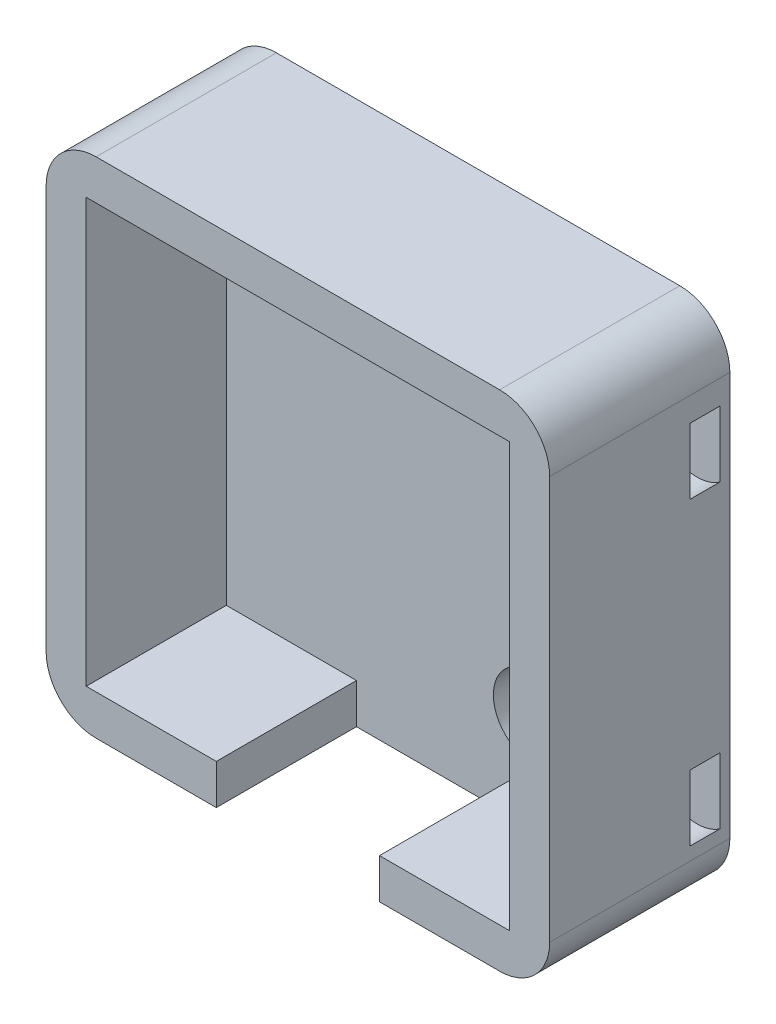
ISO-10303-21;
HEADER;
FILE_DESCRIPTION(('STEP AP214'),'2;1');
FILE_NAME('part.step','',(''),(''),'','','');
FILE_SCHEMA(('AUTOMOTIVE_DESIGN { 1 0 10303 214 1 1 1 1 }'));
ENDSEC;
DATA;
#1=APPLICATION_CONTEXT('core data for automotive mechanical design processes');
#2=APPLICATION_PROTOCOL_DEFINITION('international standard','automotive_design',2000,#1);
#3=PRODUCT_CONTEXT('',#1,'mechanical');
#4=PRODUCT('Part','Part','',(#3));
#5=PRODUCT_RELATED_PRODUCT_CATEGORY('part','',(#4));
#6=PRODUCT_DEFINITION_FORMATION('','',#4);
#7=PRODUCT_DEFINITION_CONTEXT('part definition',#1,'design');
#8=PRODUCT_DEFINITION('design','',#6,#7);
#9=PRODUCT_DEFINITION_SHAPE('','',#8);
#10=(LENGTH_UNIT() NAMED_UNIT(*) SI_UNIT(.MILLI.,.METRE.));
#11=(NAMED_UNIT(*) PLANE_ANGLE_UNIT() SI_UNIT($,.RADIAN.));
#12=(NAMED_UNIT(*) SI_UNIT($,.STERADIAN.) SOLID_ANGLE_UNIT());
#13=UNCERTAINTY_MEASURE_WITH_UNIT(LENGTH_MEASURE(1.E-05),#10,'distance_accuracy_value','');
#14=(GEOMETRIC_REPRESENTATION_CONTEXT(3) GLOBAL_UNCERTAINTY_ASSIGNED_CONTEXT((#13)) GLOBAL_UNIT_ASSIGNED_CONTEXT((#10,
#11,#12)) REPRESENTATION_CONTEXT('',''));
#15=CARTESIAN_POINT('',(0.,0.,0.));
#16=DIRECTION('',(0.,0.,1.));
#17=DIRECTION('',(1.,0.,0.));
#18=AXIS2_PLACEMENT_3D('',#15,#16,#17);
#19=CARTESIAN_POINT('',(50.3,0.,4.));
#20=DIRECTION('',(-1.,0.,0.));
#21=DIRECTION('',(0.,0.,1.));
#22=AXIS2_PLACEMENT_3D('',#19,#20,#21);
#23=PLANE('',#22);
#24=DIRECTION('',(0.,1.,0.));
#25=VECTOR('',#24,1.);
#26=CARTESIAN_POINT('',(50.3,0.,1.));
#27=LINE('',#26,#25);
#28=CARTESIAN_POINT('',(50.3,6.31049959872425,1.));
#29=VERTEX_POINT('',#28);
#30=CARTESIAN_POINT('',(50.3,12.8895004012762,1.));
#31=VERTEX_POINT('',#30);
#32=EDGE_CURVE('E295',#29,#31,#27,.T.);
#33=ORIENTED_EDGE('',*,*,#32,.F.);
#34=DIRECTION('',(0.,0.,1.));
#35=VECTOR('',#34,1.);
#36=CARTESIAN_POINT('',(50.3,6.31049959872425,1.));
#37=LINE('',#36,#35);
#38=CARTESIAN_POINT('',(50.3,6.31049959872425,4.));
#39=VERTEX_POINT('',#38);
#40=EDGE_CURVE('E292',#29,#39,#37,.T.);
#41=ORIENTED_EDGE('',*,*,#40,.T.);
#42=DIRECTION('',(0.,1.,0.));
#43=VECTOR('',#42,1.);
#44=CARTESIAN_POINT('',(50.3,0.,4.));
#45=LINE('',#44,#43);
#46=CARTESIAN_POINT('',(50.3,12.8895004012762,4.));
#47=VERTEX_POINT('',#46);
#48=EDGE_CURVE('E289',#39,#47,#45,.T.);
#49=ORIENTED_EDGE('',*,*,#48,.T.);
#50=DIRECTION('',(0.,0.,1.));
#51=VECTOR('',#50,1.);
#52=CARTESIAN_POINT('',(50.3,12.8895004012762,1.));
#53=LINE('',#52,#51);
#54=EDGE_CURVE('E202',#47,#31,#53,.F.);
#55=ORIENTED_EDGE('',*,*,#54,.T.);
#56=EDGE_LOOP('',(#33,#41,#49,#55));
#57=FACE_BOUND('',#56,.T.);
#58=DIRECTION('',(0.,1.,0.));
#59=VECTOR('',#58,1.);
#60=CARTESIAN_POINT('',(50.3,0.,0.));
#61=LINE('',#60,#59);
#62=CARTESIAN_POINT('',(50.3,5.,0.));
#63=VERTEX_POINT('',#62);
#64=CARTESIAN_POINT('',(50.3,45.3,0.));
#65=VERTEX_POINT('',#64);
#66=EDGE_CURVE('E267',#63,#65,#61,.T.);
#67=ORIENTED_EDGE('',*,*,#66,.T.);
#68=DIRECTION('',(0.,0.,-1.));
#69=VECTOR('',#68,1.);
#70=CARTESIAN_POINT('',(50.3,45.3,4.));
#71=LINE('',#70,#69);
#72=CARTESIAN_POINT('',(50.3,45.3,18.));
#73=VERTEX_POINT('',#72);
#74=EDGE_CURVE('E317',#65,#73,#71,.F.);
#75=ORIENTED_EDGE('',*,*,#74,.T.);
#76=DIRECTION('',(0.,1.,0.));
#77=VECTOR('',#76,1.);
#78=CARTESIAN_POINT('',(50.3,50.3,18.));
#79=LINE('',#78,#77);
#80=CARTESIAN_POINT('',(50.3,5.00000000000001,18.));
#81=VERTEX_POINT('',#80);
#82=EDGE_CURVE('E344',#81,#73,#79,.T.);
#83=ORIENTED_EDGE('',*,*,#82,.F.);
#84=DIRECTION('',(0.,0.,-1.));
#85=VECTOR('',#84,1.);
#86=CARTESIAN_POINT('',(50.3,5.,4.));
#87=LINE('',#86,#85);
#88=EDGE_CURVE('E314',#81,#63,#87,.T.);
#89=ORIENTED_EDGE('',*,*,#88,.T.);
#90=EDGE_LOOP('',(#67,#75,#83,#89));
#91=FACE_BOUND('',#90,.T.);
#92=DIRECTION('',(0.,1.,0.));
#93=VECTOR('',#92,1.);
#94=CARTESIAN_POINT('',(50.3,0.,1.));
#95=LINE('',#94,#93);
#96=CARTESIAN_POINT('',(50.3,36.3104995987245,1.));
#97=VERTEX_POINT('',#96);
#98=CARTESIAN_POINT('',(50.3,42.8895004012759,1.));
#99=VERTEX_POINT('',#98);
#100=EDGE_CURVE('E303',#97,#99,#95,.T.);
#101=ORIENTED_EDGE('',*,*,#100,.F.);
#102=DIRECTION('',(0.,0.,1.));
#103=VECTOR('',#102,1.);
#104=CARTESIAN_POINT('',(50.3,36.3104995987245,1.));
#105=LINE('',#104,#103);
#106=CARTESIAN_POINT('',(50.3,36.3104995987245,4.));
#107=VERTEX_POINT('',#106);
#108=EDGE_CURVE('E300',#97,#107,#105,.T.);
#109=ORIENTED_EDGE('',*,*,#108,.T.);
#110=DIRECTION('',(0.,1.,0.));
#111=VECTOR('',#110,1.);
#112=CARTESIAN_POINT('',(50.3,0.,4.));
#113=LINE('',#112,#111);
#114=CARTESIAN_POINT('',(50.3,42.8895004012759,4.));
#115=VERTEX_POINT('',#114);
#116=EDGE_CURVE('E665',#107,#115,#113,.T.);
#117=ORIENTED_EDGE('',*,*,#116,.T.);
#118=DIRECTION('',(0.,0.,1.));
#119=VECTOR('',#118,1.);
#120=CARTESIAN_POINT('',(50.3,42.8895004012759,1.));
#121=LINE('',#120,#119);
#122=EDGE_CURVE('E297',#115,#99,#121,.F.);
#123=ORIENTED_EDGE('',*,*,#122,.T.);
#124=EDGE_LOOP('',(#101,#109,#117,#123));
#125=FACE_BOUND('',#124,.T.);
#126=ADVANCED_FACE('F32',(#57,#91,#125),#23,.F.);
#127=CARTESIAN_POINT('',(34.6751338593466,9.59999999999672,18.));
#128=DIRECTION('',(0.,0.,-1.));
#129=DIRECTION('',(-1.,0.,0.));
#130=AXIS2_PLACEMENT_3D('',#127,#128,#129);
#131=CYLINDRICAL_SURFACE('',#130,1.5);
#132=CARTESIAN_POINT('',(34.6751338593466,9.59999999999672,0.));
#133=DIRECTION('',(0.,0.,-1.));
#134=DIRECTION('',(-1.,0.,0.));
#135=AXIS2_PLACEMENT_3D('',#132,#133,#134);
#136=CIRCLE('',#135,1.5);
#137=CARTESIAN_POINT('',(33.1751338593466,9.59999999999672,0.));
#138=VERTEX_POINT('',#137);
#139=EDGE_CURVE('E284',#138,#138,#136,.T.);
#140=ORIENTED_EDGE('',*,*,#139,.T.);
#141=EDGE_LOOP('',(#140));
#142=FACE_BOUND('',#141,.T.);
#143=CARTESIAN_POINT('',(34.6751338593466,9.59999999999672,1.));
#144=DIRECTION('',(0.,0.,1.));
#145=DIRECTION('',(1.,0.,0.));
#146=AXIS2_PLACEMENT_3D('',#143,#144,#145);
#147=CIRCLE('',#146,1.5);
#148=CARTESIAN_POINT('',(36.1751338593466,9.59999999999672,1.));
#149=VERTEX_POINT('',#148);
#150=EDGE_CURVE('E286',#149,#149,#147,.F.);
#151=ORIENTED_EDGE('',*,*,#150,.F.);
#152=EDGE_LOOP('',(#151));
#153=FACE_BOUND('',#152,.T.);
#154=ADVANCED_FACE('F415',(#142,#153),#131,.F.);
#155=CARTESIAN_POINT('',(34.6751338593463,39.5999999999967,18.));
#156=DIRECTION('',(0.,0.,-1.));
#157=DIRECTION('',(-1.,0.,0.));
#158=AXIS2_PLACEMENT_3D('',#155,#156,#157);
#159=CYLINDRICAL_SURFACE('',#158,1.5);
#160=CARTESIAN_POINT('',(34.6751338593463,39.5999999999967,0.));
#161=DIRECTION('',(0.,0.,-1.));
#162=DIRECTION('',(-1.,0.,0.));
#163=AXIS2_PLACEMENT_3D('',#160,#161,#162);
#164=CIRCLE('',#163,1.5);
#165=CARTESIAN_POINT('',(33.1751338593463,39.5999999999967,0.));
#166=VERTEX_POINT('',#165);
#167=EDGE_CURVE('E361',#166,#166,#164,.T.);
#168=ORIENTED_EDGE('',*,*,#167,.T.);
#169=EDGE_LOOP('',(#168));
#170=FACE_BOUND('',#169,.T.);
#171=CARTESIAN_POINT('',(34.6751338593463,39.5999999999967,1.));
#172=DIRECTION('',(0.,0.,1.));
#173=DIRECTION('',(1.,0.,0.));
#174=AXIS2_PLACEMENT_3D('',#171,#172,#173);
#175=CIRCLE('',#174,1.5);
#176=CARTESIAN_POINT('',(36.1751338593463,39.5999999999967,1.));
#177=VERTEX_POINT('',#176);
#178=EDGE_CURVE('E281',#177,#177,#175,.F.);
#179=ORIENTED_EDGE('',*,*,#178,.F.);
#180=EDGE_LOOP('',(#179));
#181=FACE_BOUND('',#180,.T.);
#182=ADVANCED_FACE('F423',(#170,#181),#159,.F.);
#183=CARTESIAN_POINT('',(0.,0.,4.));
#184=DIRECTION('',(0.,0.,-1.));
#185=DIRECTION('',(-1.,0.,0.));
#186=AXIS2_PLACEMENT_3D('',#183,#184,#185);
#187=PLANE('',#186);
#188=CARTESIAN_POINT('',(34.6751338593466,9.59999999999672,4.));
#189=DIRECTION('',(0.,0.,1.));
#190=DIRECTION('',(1.,0.,0.));
#191=AXIS2_PLACEMENT_3D('',#188,#189,#190);
#192=CIRCLE('',#191,4.00000000000001);
#193=CARTESIAN_POINT('',(38.6751338593466,9.59999999999672,4.));
#194=VERTEX_POINT('',#193);
#195=EDGE_CURVE('E675',#194,#194,#192,.T.);
#196=ORIENTED_EDGE('',*,*,#195,.F.);
#197=EDGE_LOOP('',(#196));
#198=FACE_BOUND('',#197,.T.);
#199=CARTESIAN_POINT('',(34.6751338593463,39.5999999999967,4.));
#200=DIRECTION('',(0.,0.,1.));
#201=DIRECTION('',(1.,0.,0.));
#202=AXIS2_PLACEMENT_3D('',#199,#200,#201);
#203=CIRCLE('',#202,4.);
#204=CARTESIAN_POINT('',(38.6751338593463,39.5999999999967,4.));
#205=VERTEX_POINT('',#204);
#206=EDGE_CURVE('E689',#205,#205,#203,.T.);
#207=ORIENTED_EDGE('',*,*,#206,.F.);
#208=EDGE_LOOP('',(#207));
#209=FACE_BOUND('',#208,.T.);
#210=DIRECTION('',(0.,-1.,0.));
#211=VECTOR('',#210,1.);
#212=CARTESIAN_POINT('',(46.3,46.3,4.));
#213=LINE('',#212,#211);
#214=CARTESIAN_POINT('',(46.3,35.9906960694212,4.));
#215=VERTEX_POINT('',#214);
#216=CARTESIAN_POINT('',(46.3,13.2093039305791,4.));
#217=VERTEX_POINT('',#216);
#218=EDGE_CURVE('E193',#215,#217,#213,.T.);
#219=ORIENTED_EDGE('',*,*,#218,.F.);
#220=CARTESIAN_POINT('',(48.0242172533375,39.6000000000002,4.));
#221=DIRECTION('',(0.,0.,1.));
#222=DIRECTION('',(1.,0.,0.));
#223=AXIS2_PLACEMENT_3D('',#220,#221,#222);
#224=CIRCLE('',#223,4.00000000000001);
#225=CARTESIAN_POINT('',(46.3,43.2093039305793,4.));
#226=VERTEX_POINT('',#225);
#227=EDGE_CURVE('E666',#226,#215,#224,.T.);
#228=ORIENTED_EDGE('',*,*,#227,.F.);
#229=CARTESIAN_POINT('',(46.3,46.3,4.));
#230=VERTEX_POINT('',#229);
#231=EDGE_CURVE('E215',#230,#226,#213,.T.);
#232=ORIENTED_EDGE('',*,*,#231,.F.);
#233=DIRECTION('',(1.,0.,0.));
#234=VECTOR('',#233,1.);
#235=CARTESIAN_POINT('',(4.,46.3,4.));
#236=LINE('',#235,#234);
#237=CARTESIAN_POINT('',(4.,46.3,4.));
#238=VERTEX_POINT('',#237);
#239=EDGE_CURVE('E219',#238,#230,#236,.T.);
#240=ORIENTED_EDGE('',*,*,#239,.F.);
#241=DIRECTION('',(0.,1.,0.));
#242=VECTOR('',#241,1.);
#243=CARTESIAN_POINT('',(4.,46.3,4.));
#244=LINE('',#243,#242);
#245=CARTESIAN_POINT('',(4.00000000000001,4.,4.));
#246=VERTEX_POINT('',#245);
#247=EDGE_CURVE('E359',#246,#238,#244,.T.);
#248=ORIENTED_EDGE('',*,*,#247,.F.);
#249=DIRECTION('',(-1.,0.,0.));
#250=VECTOR('',#249,1.);
#251=CARTESIAN_POINT('',(4.00000000000001,4.,4.));
#252=LINE('',#251,#250);
#253=CARTESIAN_POINT('',(17.,4.,4.));
#254=VERTEX_POINT('',#253);
#255=EDGE_CURVE('E229',#254,#246,#252,.T.);
#256=ORIENTED_EDGE('',*,*,#255,.F.);
#257=DIRECTION('',(0.,1.,0.));
#258=VECTOR('',#257,1.);
#259=CARTESIAN_POINT('',(17.,4.,4.));
#260=LINE('',#259,#258);
#261=CARTESIAN_POINT('',(17.,0.,4.));
#262=VERTEX_POINT('',#261);
#263=EDGE_CURVE('E226',#262,#254,#260,.T.);
#264=ORIENTED_EDGE('',*,*,#263,.F.);
#265=DIRECTION('',(1.,0.,0.));
#266=VECTOR('',#265,1.);
#267=CARTESIAN_POINT('',(0.,0.,4.));
#268=LINE('',#267,#266);
#269=CARTESIAN_POINT('',(33.3,0.,4.));
#270=VERTEX_POINT('',#269);
#271=EDGE_CURVE('E259',#262,#270,#268,.T.);
#272=ORIENTED_EDGE('',*,*,#271,.T.);
#273=DIRECTION('',(0.,-1.,0.));
#274=VECTOR('',#273,1.);
#275=CARTESIAN_POINT('',(33.3,4.00000000000001,4.));
#276=LINE('',#275,#274);
#277=CARTESIAN_POINT('',(33.3,4.00000000000001,4.));
#278=VERTEX_POINT('',#277);
#279=EDGE_CURVE('E223',#278,#270,#276,.T.);
#280=ORIENTED_EDGE('',*,*,#279,.F.);
#281=DIRECTION('',(-1.,0.,0.));
#282=VECTOR('',#281,1.);
#283=CARTESIAN_POINT('',(33.3,4.00000000000001,4.));
#284=LINE('',#283,#282);
#285=CARTESIAN_POINT('',(46.3,4.,4.));
#286=VERTEX_POINT('',#285);
#287=EDGE_CURVE('E218',#286,#278,#284,.T.);
#288=ORIENTED_EDGE('',*,*,#287,.F.);
#289=CARTESIAN_POINT('',(46.3,5.99069606942131,4.));
#290=VERTEX_POINT('',#289);
#291=EDGE_CURVE('E194',#290,#286,#213,.T.);
#292=ORIENTED_EDGE('',*,*,#291,.F.);
#293=CARTESIAN_POINT('',(48.0242172533378,9.60000000000021,4.));
#294=DIRECTION('',(0.,0.,1.));
#295=DIRECTION('',(1.,0.,0.));
#296=AXIS2_PLACEMENT_3D('',#293,#294,#295);
#297=CIRCLE('',#296,4.00000000000001);
#298=EDGE_CURVE('E200',#217,#290,#297,.T.);
#299=ORIENTED_EDGE('',*,*,#298,.F.);
#300=EDGE_LOOP('',(#219,#228,#232,#240,#248,#256,#264,#272,#280,#288,#292,#299));
#301=FACE_BOUND('',#300,.T.);
#302=ADVANCED_FACE('F208',(#198,#209,#301),#187,.F.);
#303=CARTESIAN_POINT('',(0.,0.,4.));
#304=DIRECTION('',(1.,0.,0.));
#305=DIRECTION('',(0.,0.,-1.));
#306=AXIS2_PLACEMENT_3D('',#303,#304,#305);
#307=PLANE('',#306);
#308=DIRECTION('',(0.,-1.,0.));
#309=VECTOR('',#308,1.);
#310=CARTESIAN_POINT('',(0.,0.,0.));
#311=LINE('',#310,#309);
#312=CARTESIAN_POINT('',(0.,45.3,0.));
#313=VERTEX_POINT('',#312);
#314=CARTESIAN_POINT('',(0.,5.,0.));
#315=VERTEX_POINT('',#314);
#316=EDGE_CURVE('E258',#313,#315,#311,.T.);
#317=ORIENTED_EDGE('',*,*,#316,.T.);
#318=DIRECTION('',(0.,0.,-1.));
#319=VECTOR('',#318,1.);
#320=CARTESIAN_POINT('',(0.,5.,4.));
#321=LINE('',#320,#319);
#322=CARTESIAN_POINT('',(0.,5.00000000000001,18.));
#323=VERTEX_POINT('',#322);
#324=EDGE_CURVE('E11',#315,#323,#321,.F.);
#325=ORIENTED_EDGE('',*,*,#324,.T.);
#326=DIRECTION('',(0.,-1.,0.));
#327=VECTOR('',#326,1.);
#328=CARTESIAN_POINT('',(0.,50.3,18.));
#329=LINE('',#328,#327);
#330=CARTESIAN_POINT('',(0.,45.3,18.));
#331=VERTEX_POINT('',#330);
#332=EDGE_CURVE('E349',#331,#323,#329,.T.);
#333=ORIENTED_EDGE('',*,*,#332,.F.);
#334=DIRECTION('',(0.,0.,-1.));
#335=VECTOR('',#334,1.);
#336=CARTESIAN_POINT('',(0.,45.3,4.));
#337=LINE('',#336,#335);
#338=EDGE_CURVE('E261',#331,#313,#337,.T.);
#339=ORIENTED_EDGE('',*,*,#338,.T.);
#340=EDGE_LOOP('',(#317,#325,#333,#339));
#341=FACE_BOUND('',#340,.T.);
#342=ADVANCED_FACE('F433',(#341),#307,.F.);
#343=CARTESIAN_POINT('',(0.,0.,4.));
#344=DIRECTION('',(0.,1.,0.));
#345=DIRECTION('',(0.,0.,1.));
#346=AXIS2_PLACEMENT_3D('',#343,#344,#345);
#347=PLANE('',#346);
#348=DIRECTION('',(1.,0.,0.));
#349=VECTOR('',#348,1.);
#350=CARTESIAN_POINT('',(0.,0.,18.));
#351=LINE('',#350,#349);
#352=CARTESIAN_POINT('',(5.,0.,18.));
#353=VERTEX_POINT('',#352);
#354=CARTESIAN_POINT('',(17.,0.,18.));
#355=VERTEX_POINT('',#354);
#356=EDGE_CURVE('E329',#353,#355,#351,.T.);
#357=ORIENTED_EDGE('',*,*,#356,.F.);
#358=DIRECTION('',(0.,0.,-1.));
#359=VECTOR('',#358,1.);
#360=CARTESIAN_POINT('',(5.,0.,4.));
#361=LINE('',#360,#359);
#362=CARTESIAN_POINT('',(5.,0.,0.));
#363=VERTEX_POINT('',#362);
#364=EDGE_CURVE('E40',#353,#363,#361,.T.);
#365=ORIENTED_EDGE('',*,*,#364,.T.);
#366=DIRECTION('',(1.,0.,0.));
#367=VECTOR('',#366,1.);
#368=CARTESIAN_POINT('',(0.,0.,0.));
#369=LINE('',#368,#367);
#370=CARTESIAN_POINT('',(45.3,0.,0.));
#371=VERTEX_POINT('',#370);
#372=EDGE_CURVE('E265',#363,#371,#369,.T.);
#373=ORIENTED_EDGE('',*,*,#372,.T.);
#374=DIRECTION('',(0.,0.,-1.));
#375=VECTOR('',#374,1.);
#376=CARTESIAN_POINT('',(45.3,0.,4.));
#377=LINE('',#376,#375);
#378=CARTESIAN_POINT('',(45.3,0.,18.));
#379=VERTEX_POINT('',#378);
#380=EDGE_CURVE('E47',#371,#379,#377,.F.);
#381=ORIENTED_EDGE('',*,*,#380,.T.);
#382=DIRECTION('',(1.,0.,0.));
#383=VECTOR('',#382,1.);
#384=CARTESIAN_POINT('',(33.3,0.,18.));
#385=LINE('',#384,#383);
#386=CARTESIAN_POINT('',(33.3,0.,18.));
#387=VERTEX_POINT('',#386);
#388=EDGE_CURVE('E347',#387,#379,#385,.T.);
#389=ORIENTED_EDGE('',*,*,#388,.F.);
#390=DIRECTION('',(0.,0.,-1.));
#391=VECTOR('',#390,1.);
#392=CARTESIAN_POINT('',(33.3,0.,18.));
#393=LINE('',#392,#391);
#394=EDGE_CURVE('E243',#387,#270,#393,.T.);
#395=ORIENTED_EDGE('',*,*,#394,.T.);
#396=ORIENTED_EDGE('',*,*,#271,.F.);
#397=DIRECTION('',(0.,0.,-1.));
#398=VECTOR('',#397,1.);
#399=CARTESIAN_POINT('',(17.,0.,18.));
#400=LINE('',#399,#398);
#401=EDGE_CURVE('E240',#355,#262,#400,.T.);
#402=ORIENTED_EDGE('',*,*,#401,.F.);
#403=EDGE_LOOP('',(#357,#365,#373,#381,#389,#395,#396,#402));
#404=FACE_BOUND('',#403,.T.);
#405=ADVANCED_FACE('F327',(#404),#347,.F.);
#406=CARTESIAN_POINT('',(0.,50.3,4.));
#407=DIRECTION('',(0.,-1.,0.));
#408=DIRECTION('',(0.,0.,-1.));
#409=AXIS2_PLACEMENT_3D('',#406,#407,#408);
#410=PLANE('',#409);
#411=DIRECTION('',(-1.,0.,0.));
#412=VECTOR('',#411,1.);
#413=CARTESIAN_POINT('',(0.,50.3,18.));
#414=LINE('',#413,#412);
#415=CARTESIAN_POINT('',(45.3,50.3,18.));
#416=VERTEX_POINT('',#415);
#417=CARTESIAN_POINT('',(5.,50.3,18.));
#418=VERTEX_POINT('',#417);
#419=EDGE_CURVE('E346',#416,#418,#414,.T.);
#420=ORIENTED_EDGE('',*,*,#419,.F.);
#421=DIRECTION('',(0.,0.,-1.));
#422=VECTOR('',#421,1.);
#423=CARTESIAN_POINT('',(45.3,50.3,4.));
#424=LINE('',#423,#422);
#425=CARTESIAN_POINT('',(45.3,50.3,0.));
#426=VERTEX_POINT('',#425);
#427=EDGE_CURVE('E305',#416,#426,#424,.T.);
#428=ORIENTED_EDGE('',*,*,#427,.T.);
#429=DIRECTION('',(-1.,0.,0.));
#430=VECTOR('',#429,1.);
#431=CARTESIAN_POINT('',(0.,50.3,0.));
#432=LINE('',#431,#430);
#433=CARTESIAN_POINT('',(5.,50.3,0.));
#434=VERTEX_POINT('',#433);
#435=EDGE_CURVE('E262',#426,#434,#432,.T.);
#436=ORIENTED_EDGE('',*,*,#435,.T.);
#437=DIRECTION('',(0.,0.,-1.));
#438=VECTOR('',#437,1.);
#439=CARTESIAN_POINT('',(5.,50.3,4.));
#440=LINE('',#439,#438);
#441=EDGE_CURVE('E276',#434,#418,#440,.F.);
#442=ORIENTED_EDGE('',*,*,#441,.T.);
#443=EDGE_LOOP('',(#420,#428,#436,#442));
#444=FACE_BOUND('',#443,.T.);
#445=ADVANCED_FACE('F429',(#444),#410,.F.);
#446=CARTESIAN_POINT('',(0.,0.,0.));
#447=DIRECTION('',(0.,0.,-1.));
#448=DIRECTION('',(-1.,0.,0.));
#449=AXIS2_PLACEMENT_3D('',#446,#447,#448);
#450=PLANE('',#449);
#451=ORIENTED_EDGE('',*,*,#139,.F.);
#452=EDGE_LOOP('',(#451));
#453=FACE_BOUND('',#452,.T.);
#454=ORIENTED_EDGE('',*,*,#167,.F.);
#455=EDGE_LOOP('',(#454));
#456=FACE_BOUND('',#455,.T.);
#457=ORIENTED_EDGE('',*,*,#435,.F.);
#458=CARTESIAN_POINT('',(45.3,45.3,0.));
#459=DIRECTION('',(0.,0.,-1.));
#460=DIRECTION('',(-1.,0.,0.));
#461=AXIS2_PLACEMENT_3D('',#458,#459,#460);
#462=CIRCLE('',#461,5.);
#463=EDGE_CURVE('E312',#426,#65,#462,.T.);
#464=ORIENTED_EDGE('',*,*,#463,.T.);
#465=ORIENTED_EDGE('',*,*,#66,.F.);
#466=CARTESIAN_POINT('',(45.3,5.,0.));
#467=DIRECTION('',(0.,0.,-1.));
#468=DIRECTION('',(-1.,0.,0.));
#469=AXIS2_PLACEMENT_3D('',#466,#467,#468);
#470=CIRCLE('',#469,5.);
#471=EDGE_CURVE('E308',#63,#371,#470,.T.);
#472=ORIENTED_EDGE('',*,*,#471,.T.);
#473=ORIENTED_EDGE('',*,*,#372,.F.);
#474=CARTESIAN_POINT('',(5.,5.,0.));
#475=DIRECTION('',(0.,0.,-1.));
#476=DIRECTION('',(-1.,0.,0.));
#477=AXIS2_PLACEMENT_3D('',#474,#475,#476);
#478=CIRCLE('',#477,5.);
#479=EDGE_CURVE('E310',#363,#315,#478,.T.);
#480=ORIENTED_EDGE('',*,*,#479,.T.);
#481=ORIENTED_EDGE('',*,*,#316,.F.);
#482=CARTESIAN_POINT('',(5.,45.3,0.));
#483=DIRECTION('',(0.,0.,-1.));
#484=DIRECTION('',(-1.,0.,0.));
#485=AXIS2_PLACEMENT_3D('',#482,#483,#484);
#486=CIRCLE('',#485,5.);
#487=EDGE_CURVE('E273',#313,#434,#486,.T.);
#488=ORIENTED_EDGE('',*,*,#487,.T.);
#489=EDGE_LOOP('',(#457,#464,#465,#472,#473,#480,#481,#488));
#490=FACE_BOUND('',#489,.T.);
#491=ADVANCED_FACE('F333',(#453,#456,#490),#450,.T.);
#492=CARTESIAN_POINT('',(4.,46.3,18.));
#493=DIRECTION('',(-1.,0.,0.));
#494=DIRECTION('',(0.,-1.,0.));
#495=AXIS2_PLACEMENT_3D('',#492,#493,#494);
#496=PLANE('',#495);
#497=ORIENTED_EDGE('',*,*,#247,.T.);
#498=DIRECTION('',(0.,0.,-1.));
#499=VECTOR('',#498,1.);
#500=CARTESIAN_POINT('',(4.,46.3,18.));
#501=LINE('',#500,#499);
#502=CARTESIAN_POINT('',(4.,46.3,18.));
#503=VERTEX_POINT('',#502);
#504=EDGE_CURVE('E255',#503,#238,#501,.T.);
#505=ORIENTED_EDGE('',*,*,#504,.F.);
#506=DIRECTION('',(0.,1.,0.));
#507=VECTOR('',#506,1.);
#508=CARTESIAN_POINT('',(4.,46.3,18.));
#509=LINE('',#508,#507);
#510=CARTESIAN_POINT('',(4.00000000000001,4.,18.));
#511=VERTEX_POINT('',#510);
#512=EDGE_CURVE('E232',#511,#503,#509,.T.);
#513=ORIENTED_EDGE('',*,*,#512,.F.);
#514=DIRECTION('',(0.,0.,-1.));
#515=VECTOR('',#514,1.);
#516=CARTESIAN_POINT('',(4.00000000000001,4.,18.));
#517=LINE('',#516,#515);
#518=EDGE_CURVE('E233',#511,#246,#517,.T.);
#519=ORIENTED_EDGE('',*,*,#518,.T.);
#520=EDGE_LOOP('',(#497,#505,#513,#519));
#521=FACE_BOUND('',#520,.T.);
#522=ADVANCED_FACE('F397',(#521),#496,.F.);
#523=CARTESIAN_POINT('',(4.,46.3,18.));
#524=DIRECTION('',(0.,1.,0.));
#525=DIRECTION('',(0.,0.,1.));
#526=AXIS2_PLACEMENT_3D('',#523,#524,#525);
#527=PLANE('',#526);
#528=ORIENTED_EDGE('',*,*,#239,.T.);
#529=DIRECTION('',(0.,0.,-1.));
#530=VECTOR('',#529,1.);
#531=CARTESIAN_POINT('',(46.3,46.3,18.));
#532=LINE('',#531,#530);
#533=CARTESIAN_POINT('',(46.3,46.3,18.));
#534=VERTEX_POINT('',#533);
#535=EDGE_CURVE('E252',#534,#230,#532,.T.);
#536=ORIENTED_EDGE('',*,*,#535,.F.);
#537=DIRECTION('',(1.,0.,0.));
#538=VECTOR('',#537,1.);
#539=CARTESIAN_POINT('',(4.,46.3,18.));
#540=LINE('',#539,#538);
#541=EDGE_CURVE('E375',#503,#534,#540,.T.);
#542=ORIENTED_EDGE('',*,*,#541,.F.);
#543=ORIENTED_EDGE('',*,*,#504,.T.);
#544=EDGE_LOOP('',(#528,#536,#542,#543));
#545=FACE_BOUND('',#544,.T.);
#546=ADVANCED_FACE('F399',(#545),#527,.F.);
#547=CARTESIAN_POINT('',(46.3,46.3,18.));
#548=DIRECTION('',(1.,0.,0.));
#549=DIRECTION('',(0.,1.,0.));
#550=AXIS2_PLACEMENT_3D('',#547,#548,#549);
#551=PLANE('',#550);
#552=ORIENTED_EDGE('',*,*,#231,.T.);
#553=EDGE_CURVE('E214',#226,#215,#213,.T.);
#554=ORIENTED_EDGE('',*,*,#553,.T.);
#555=ORIENTED_EDGE('',*,*,#218,.T.);
#556=EDGE_CURVE('E183',#217,#290,#213,.T.);
#557=ORIENTED_EDGE('',*,*,#556,.T.);
#558=ORIENTED_EDGE('',*,*,#291,.T.);
#559=DIRECTION('',(0.,0.,-1.));
#560=VECTOR('',#559,1.);
#561=CARTESIAN_POINT('',(46.3,4.,18.));
#562=LINE('',#561,#560);
#563=CARTESIAN_POINT('',(46.3,4.,18.));
#564=VERTEX_POINT('',#563);
#565=EDGE_CURVE('E249',#564,#286,#562,.T.);
#566=ORIENTED_EDGE('',*,*,#565,.F.);
#567=DIRECTION('',(0.,-1.,0.));
#568=VECTOR('',#567,1.);
#569=CARTESIAN_POINT('',(46.3,46.3,18.));
#570=LINE('',#569,#568);
#571=EDGE_CURVE('E377',#534,#564,#570,.T.);
#572=ORIENTED_EDGE('',*,*,#571,.F.);
#573=ORIENTED_EDGE('',*,*,#535,.T.);
#574=EDGE_LOOP('',(#552,#554,#555,#557,#558,#566,#572,#573));
#575=FACE_BOUND('',#574,.T.);
#576=ADVANCED_FACE('F213',(#575),#551,.F.);
#577=CARTESIAN_POINT('',(33.3,4.00000000000001,18.));
#578=DIRECTION('',(0.,-1.,0.));
#579=DIRECTION('',(1.,0.,0.));
#580=AXIS2_PLACEMENT_3D('',#577,#578,#579);
#581=PLANE('',#580);
#582=ORIENTED_EDGE('',*,*,#287,.T.);
#583=DIRECTION('',(0.,0.,-1.));
#584=VECTOR('',#583,1.);
#585=CARTESIAN_POINT('',(33.3,4.00000000000001,18.));
#586=LINE('',#585,#584);
#587=CARTESIAN_POINT('',(33.3,4.00000000000001,18.));
#588=VERTEX_POINT('',#587);
#589=EDGE_CURVE('E246',#588,#278,#586,.T.);
#590=ORIENTED_EDGE('',*,*,#589,.F.);
#591=DIRECTION('',(-1.,0.,0.));
#592=VECTOR('',#591,1.);
#593=CARTESIAN_POINT('',(33.3,4.00000000000001,18.));
#594=LINE('',#593,#592);
#595=EDGE_CURVE('E379',#564,#588,#594,.T.);
#596=ORIENTED_EDGE('',*,*,#595,.F.);
#597=ORIENTED_EDGE('',*,*,#565,.T.);
#598=EDGE_LOOP('',(#582,#590,#596,#597));
#599=FACE_BOUND('',#598,.T.);
#600=ADVANCED_FACE('F404',(#599),#581,.F.);
#601=CARTESIAN_POINT('',(33.3,4.00000000000001,18.));
#602=DIRECTION('',(1.,0.,0.));
#603=DIRECTION('',(0.,0.,-1.));
#604=AXIS2_PLACEMENT_3D('',#601,#602,#603);
#605=PLANE('',#604);
#606=ORIENTED_EDGE('',*,*,#279,.T.);
#607=ORIENTED_EDGE('',*,*,#394,.F.);
#608=DIRECTION('',(0.,-1.,0.));
#609=VECTOR('',#608,1.);
#610=CARTESIAN_POINT('',(33.3,4.00000000000001,18.));
#611=LINE('',#610,#609);
#612=EDGE_CURVE('E351',#588,#387,#611,.T.);
#613=ORIENTED_EDGE('',*,*,#612,.F.);
#614=ORIENTED_EDGE('',*,*,#589,.T.);
#615=EDGE_LOOP('',(#606,#607,#613,#614));
#616=FACE_BOUND('',#615,.T.);
#617=ADVANCED_FACE('F386',(#616),#605,.F.);
#618=CARTESIAN_POINT('',(17.,4.,18.));
#619=DIRECTION('',(-1.,0.,0.));
#620=DIRECTION('',(0.,0.,1.));
#621=AXIS2_PLACEMENT_3D('',#618,#619,#620);
#622=PLANE('',#621);
#623=ORIENTED_EDGE('',*,*,#263,.T.);
#624=DIRECTION('',(0.,0.,-1.));
#625=VECTOR('',#624,1.);
#626=CARTESIAN_POINT('',(17.,4.,18.));
#627=LINE('',#626,#625);
#628=CARTESIAN_POINT('',(17.,4.,18.));
#629=VERTEX_POINT('',#628);
#630=EDGE_CURVE('E236',#629,#254,#627,.T.);
#631=ORIENTED_EDGE('',*,*,#630,.F.);
#632=DIRECTION('',(0.,1.,0.));
#633=VECTOR('',#632,1.);
#634=CARTESIAN_POINT('',(17.,4.,18.));
#635=LINE('',#634,#633);
#636=EDGE_CURVE('E357',#355,#629,#635,.T.);
#637=ORIENTED_EDGE('',*,*,#636,.F.);
#638=ORIENTED_EDGE('',*,*,#401,.T.);
#639=EDGE_LOOP('',(#623,#631,#637,#638));
#640=FACE_BOUND('',#639,.T.);
#641=ADVANCED_FACE('F390',(#640),#622,.F.);
#642=CARTESIAN_POINT('',(4.00000000000001,4.,18.));
#643=DIRECTION('',(0.,-1.,0.));
#644=DIRECTION('',(1.,0.,0.));
#645=AXIS2_PLACEMENT_3D('',#642,#643,#644);
#646=PLANE('',#645);
#647=ORIENTED_EDGE('',*,*,#255,.T.);
#648=ORIENTED_EDGE('',*,*,#518,.F.);
#649=DIRECTION('',(-1.,0.,0.));
#650=VECTOR('',#649,1.);
#651=CARTESIAN_POINT('',(4.00000000000001,4.,18.));
#652=LINE('',#651,#650);
#653=EDGE_CURVE('E237',#629,#511,#652,.T.);
#654=ORIENTED_EDGE('',*,*,#653,.F.);
#655=ORIENTED_EDGE('',*,*,#630,.T.);
#656=EDGE_LOOP('',(#647,#648,#654,#655));
#657=FACE_BOUND('',#656,.T.);
#658=ADVANCED_FACE('F396',(#657),#646,.F.);
#659=CARTESIAN_POINT('',(0.,0.,18.));
#660=DIRECTION('',(0.,0.,1.));
#661=DIRECTION('',(1.,0.,0.));
#662=AXIS2_PLACEMENT_3D('',#659,#660,#661);
#663=PLANE('',#662);
#664=ORIENTED_EDGE('',*,*,#82,.T.);
#665=CARTESIAN_POINT('',(45.3,45.3,18.));
#666=DIRECTION('',(0.,0.,1.));
#667=DIRECTION('',(1.,0.,0.));
#668=AXIS2_PLACEMENT_3D('',#665,#666,#667);
#669=CIRCLE('',#668,5.);
#670=EDGE_CURVE('E322',#73,#416,#669,.T.);
#671=ORIENTED_EDGE('',*,*,#670,.T.);
#672=ORIENTED_EDGE('',*,*,#419,.T.);
#673=CARTESIAN_POINT('',(5.,45.3,18.));
#674=DIRECTION('',(0.,0.,1.));
#675=DIRECTION('',(1.,0.,0.));
#676=AXIS2_PLACEMENT_3D('',#673,#674,#675);
#677=CIRCLE('',#676,5.);
#678=EDGE_CURVE('E279',#418,#331,#677,.T.);
#679=ORIENTED_EDGE('',*,*,#678,.T.);
#680=ORIENTED_EDGE('',*,*,#332,.T.);
#681=CARTESIAN_POINT('',(5.,5.,18.));
#682=DIRECTION('',(0.,0.,1.));
#683=DIRECTION('',(1.,0.,0.));
#684=AXIS2_PLACEMENT_3D('',#681,#682,#683);
#685=CIRCLE('',#684,5.);
#686=EDGE_CURVE('E55',#323,#353,#685,.T.);
#687=ORIENTED_EDGE('',*,*,#686,.T.);
#688=ORIENTED_EDGE('',*,*,#356,.T.);
#689=ORIENTED_EDGE('',*,*,#636,.T.);
#690=ORIENTED_EDGE('',*,*,#653,.T.);
#691=ORIENTED_EDGE('',*,*,#512,.T.);
#692=ORIENTED_EDGE('',*,*,#541,.T.);
#693=ORIENTED_EDGE('',*,*,#571,.T.);
#694=ORIENTED_EDGE('',*,*,#595,.T.);
#695=ORIENTED_EDGE('',*,*,#612,.T.);
#696=ORIENTED_EDGE('',*,*,#388,.T.);
#697=CARTESIAN_POINT('',(45.3,5.,18.));
#698=DIRECTION('',(0.,0.,1.));
#699=DIRECTION('',(1.,0.,0.));
#700=AXIS2_PLACEMENT_3D('',#697,#698,#699);
#701=CIRCLE('',#700,5.);
#702=EDGE_CURVE('E319',#379,#81,#701,.T.);
#703=ORIENTED_EDGE('',*,*,#702,.T.);
#704=EDGE_LOOP('',(#664,#671,#672,#679,#680,#687,#688,#689,#690,#691,#692,#693,#694,#695,#696,#703));
#705=FACE_BOUND('',#704,.T.);
#706=ADVANCED_FACE('F382',(#705),#663,.T.);
#707=CARTESIAN_POINT('',(5.,45.3,4.));
#708=DIRECTION('',(0.,0.,-1.));
#709=DIRECTION('',(-1.,0.,0.));
#710=AXIS2_PLACEMENT_3D('',#707,#708,#709);
#711=CYLINDRICAL_SURFACE('',#710,5.);
#712=ORIENTED_EDGE('',*,*,#678,.F.);
#713=ORIENTED_EDGE('',*,*,#441,.F.);
#714=ORIENTED_EDGE('',*,*,#487,.F.);
#715=ORIENTED_EDGE('',*,*,#338,.F.);
#716=EDGE_LOOP('',(#712,#713,#714,#715));
#717=FACE_BOUND('',#716,.T.);
#718=ADVANCED_FACE('F436',(#717),#711,.T.);
#719=CARTESIAN_POINT('',(34.6751338593463,39.5999999999967,1.));
#720=DIRECTION('',(0.,0.,1.));
#721=DIRECTION('',(1.,0.,0.));
#722=AXIS2_PLACEMENT_3D('',#719,#720,#721);
#723=PLANE('',#722);
#724=CARTESIAN_POINT('',(34.6751338593463,39.5999999999967,1.));
#725=DIRECTION('',(0.,0.,1.));
#726=DIRECTION('',(1.,0.,0.));
#727=AXIS2_PLACEMENT_3D('',#724,#725,#726);
#728=CIRCLE('',#727,4.);
#729=CARTESIAN_POINT('',(38.6751338593463,39.5999999999967,1.));
#730=VERTEX_POINT('',#729);
#731=EDGE_CURVE('E285',#730,#730,#728,.T.);
#732=ORIENTED_EDGE('',*,*,#731,.T.);
#733=EDGE_LOOP('',(#732));
#734=FACE_BOUND('',#733,.T.);
#735=ORIENTED_EDGE('',*,*,#178,.T.);
#736=EDGE_LOOP('',(#735));
#737=FACE_BOUND('',#736,.T.);
#738=ADVANCED_FACE('F439',(#734,#737),#723,.T.);
#739=CARTESIAN_POINT('',(34.6751338593463,39.5999999999967,1.));
#740=DIRECTION('',(0.,0.,1.));
#741=DIRECTION('',(1.,0.,0.));
#742=AXIS2_PLACEMENT_3D('',#739,#740,#741);
#743=CYLINDRICAL_SURFACE('',#742,4.);
#744=ORIENTED_EDGE('',*,*,#731,.F.);
#745=EDGE_LOOP('',(#744));
#746=FACE_BOUND('',#745,.T.);
#747=ORIENTED_EDGE('',*,*,#206,.T.);
#748=EDGE_LOOP('',(#747));
#749=FACE_BOUND('',#748,.T.);
#750=ADVANCED_FACE('F495',(#746,#749),#743,.F.);
#751=CARTESIAN_POINT('',(34.6751338593466,9.59999999999672,1.));
#752=DIRECTION('',(0.,0.,1.));
#753=DIRECTION('',(1.,0.,0.));
#754=AXIS2_PLACEMENT_3D('',#751,#752,#753);
#755=PLANE('',#754);
#756=CARTESIAN_POINT('',(34.6751338593466,9.59999999999672,1.));
#757=DIRECTION('',(0.,0.,1.));
#758=DIRECTION('',(1.,0.,0.));
#759=AXIS2_PLACEMENT_3D('',#756,#757,#758);
#760=CIRCLE('',#759,4.00000000000001);
#761=CARTESIAN_POINT('',(38.6751338593466,9.59999999999672,1.));
#762=VERTEX_POINT('',#761);
#763=EDGE_CURVE('E290',#762,#762,#760,.T.);
#764=ORIENTED_EDGE('',*,*,#763,.T.);
#765=EDGE_LOOP('',(#764));
#766=FACE_BOUND('',#765,.T.);
#767=ORIENTED_EDGE('',*,*,#150,.T.);
#768=EDGE_LOOP('',(#767));
#769=FACE_BOUND('',#768,.T.);
#770=ADVANCED_FACE('F506',(#766,#769),#755,.T.);
#771=CARTESIAN_POINT('',(34.6751338593466,9.59999999999672,1.));
#772=DIRECTION('',(0.,0.,1.));
#773=DIRECTION('',(1.,0.,0.));
#774=AXIS2_PLACEMENT_3D('',#771,#772,#773);
#775=CYLINDRICAL_SURFACE('',#774,4.00000000000001);
#776=ORIENTED_EDGE('',*,*,#763,.F.);
#777=EDGE_LOOP('',(#776));
#778=FACE_BOUND('',#777,.T.);
#779=ORIENTED_EDGE('',*,*,#195,.T.);
#780=EDGE_LOOP('',(#779));
#781=FACE_BOUND('',#780,.T.);
#782=ADVANCED_FACE('F516',(#778,#781),#775,.F.);
#783=CARTESIAN_POINT('',(48.0242172533378,9.60000000000021,1.));
#784=DIRECTION('',(0.,0.,1.));
#785=DIRECTION('',(1.,0.,0.));
#786=AXIS2_PLACEMENT_3D('',#783,#784,#785);
#787=CYLINDRICAL_SURFACE('',#786,4.00000000000001);
#788=CARTESIAN_POINT('',(48.0242172533378,9.60000000000021,1.));
#789=DIRECTION('',(0.,0.,1.));
#790=DIRECTION('',(1.,0.,0.));
#791=AXIS2_PLACEMENT_3D('',#788,#789,#790);
#792=CIRCLE('',#791,4.00000000000001);
#793=EDGE_CURVE('E204',#31,#29,#792,.T.);
#794=ORIENTED_EDGE('',*,*,#793,.F.);
#795=ORIENTED_EDGE('',*,*,#54,.F.);
#796=EDGE_CURVE('E186',#47,#217,#297,.T.);
#797=ORIENTED_EDGE('',*,*,#796,.T.);
#798=ORIENTED_EDGE('',*,*,#298,.T.);
#799=EDGE_CURVE('E189',#290,#39,#297,.T.);
#800=ORIENTED_EDGE('',*,*,#799,.T.);
#801=ORIENTED_EDGE('',*,*,#40,.F.);
#802=EDGE_LOOP('',(#794,#795,#797,#798,#800,#801));
#803=FACE_BOUND('',#802,.T.);
#804=ADVANCED_FACE('F199',(#803),#787,.F.);
#805=CARTESIAN_POINT('',(48.0242172533378,9.60000000000021,1.));
#806=DIRECTION('',(0.,0.,1.));
#807=DIRECTION('',(1.,0.,0.));
#808=AXIS2_PLACEMENT_3D('',#805,#806,#807);
#809=PLANE('',#808);
#810=ORIENTED_EDGE('',*,*,#32,.T.);
#811=ORIENTED_EDGE('',*,*,#793,.T.);
#812=EDGE_LOOP('',(#810,#811));
#813=FACE_BOUND('',#812,.T.);
#814=ADVANCED_FACE('F535',(#813),#809,.T.);
#815=CARTESIAN_POINT('',(48.0242172533378,9.60000000000021,4.));
#816=DIRECTION('',(0.,0.,1.));
#817=DIRECTION('',(1.,0.,0.));
#818=AXIS2_PLACEMENT_3D('',#815,#816,#817);
#819=PLANE('',#818);
#820=ORIENTED_EDGE('',*,*,#799,.F.);
#821=ORIENTED_EDGE('',*,*,#556,.F.);
#822=ORIENTED_EDGE('',*,*,#796,.F.);
#823=ORIENTED_EDGE('',*,*,#48,.F.);
#824=EDGE_LOOP('',(#820,#821,#822,#823));
#825=FACE_BOUND('',#824,.T.);
#826=ADVANCED_FACE('F185',(#825),#819,.F.);
#827=CARTESIAN_POINT('',(48.0242172533375,39.6000000000002,1.));
#828=DIRECTION('',(0.,0.,1.));
#829=DIRECTION('',(1.,0.,0.));
#830=AXIS2_PLACEMENT_3D('',#827,#828,#829);
#831=CYLINDRICAL_SURFACE('',#830,4.00000000000001);
#832=CARTESIAN_POINT('',(48.0242172533375,39.6000000000002,1.));
#833=DIRECTION('',(0.,0.,1.));
#834=DIRECTION('',(1.,0.,0.));
#835=AXIS2_PLACEMENT_3D('',#832,#833,#834);
#836=CIRCLE('',#835,4.00000000000001);
#837=EDGE_CURVE('E672',#99,#97,#836,.T.);
#838=ORIENTED_EDGE('',*,*,#837,.F.);
#839=ORIENTED_EDGE('',*,*,#122,.F.);
#840=EDGE_CURVE('E668',#115,#226,#224,.T.);
#841=ORIENTED_EDGE('',*,*,#840,.T.);
#842=ORIENTED_EDGE('',*,*,#227,.T.);
#843=EDGE_CURVE('E662',#215,#107,#224,.T.);
#844=ORIENTED_EDGE('',*,*,#843,.T.);
#845=ORIENTED_EDGE('',*,*,#108,.F.);
#846=EDGE_LOOP('',(#838,#839,#841,#842,#844,#845));
#847=FACE_BOUND('',#846,.T.);
#848=ADVANCED_FACE('F553',(#847),#831,.F.);
#849=CARTESIAN_POINT('',(48.0242172533375,39.6000000000002,1.));
#850=DIRECTION('',(0.,0.,1.));
#851=DIRECTION('',(1.,0.,0.));
#852=AXIS2_PLACEMENT_3D('',#849,#850,#851);
#853=PLANE('',#852);
#854=ORIENTED_EDGE('',*,*,#100,.T.);
#855=ORIENTED_EDGE('',*,*,#837,.T.);
#856=EDGE_LOOP('',(#854,#855));
#857=FACE_BOUND('',#856,.T.);
#858=ADVANCED_FACE('F562',(#857),#853,.T.);
#859=CARTESIAN_POINT('',(48.0242172533375,39.6000000000002,4.));
#860=DIRECTION('',(0.,0.,1.));
#861=DIRECTION('',(1.,0.,0.));
#862=AXIS2_PLACEMENT_3D('',#859,#860,#861);
#863=PLANE('',#862);
#864=ORIENTED_EDGE('',*,*,#843,.F.);
#865=ORIENTED_EDGE('',*,*,#553,.F.);
#866=ORIENTED_EDGE('',*,*,#840,.F.);
#867=ORIENTED_EDGE('',*,*,#116,.F.);
#868=EDGE_LOOP('',(#864,#865,#866,#867));
#869=FACE_BOUND('',#868,.T.);
#870=ADVANCED_FACE('F444',(#869),#863,.F.);
#871=CARTESIAN_POINT('',(45.3,45.3,4.));
#872=DIRECTION('',(0.,0.,-1.));
#873=DIRECTION('',(-1.,0.,0.));
#874=AXIS2_PLACEMENT_3D('',#871,#872,#873);
#875=CYLINDRICAL_SURFACE('',#874,5.);
#876=ORIENTED_EDGE('',*,*,#670,.F.);
#877=ORIENTED_EDGE('',*,*,#74,.F.);
#878=ORIENTED_EDGE('',*,*,#463,.F.);
#879=ORIENTED_EDGE('',*,*,#427,.F.);
#880=EDGE_LOOP('',(#876,#877,#878,#879));
#881=FACE_BOUND('',#880,.T.);
#882=ADVANCED_FACE('F441',(#881),#875,.T.);
#883=CARTESIAN_POINT('',(5.,5.,4.));
#884=DIRECTION('',(0.,0.,-1.));
#885=DIRECTION('',(-1.,0.,0.));
#886=AXIS2_PLACEMENT_3D('',#883,#884,#885);
#887=CYLINDRICAL_SURFACE('',#886,5.);
#888=ORIENTED_EDGE('',*,*,#686,.F.);
#889=ORIENTED_EDGE('',*,*,#324,.F.);
#890=ORIENTED_EDGE('',*,*,#479,.F.);
#891=ORIENTED_EDGE('',*,*,#364,.F.);
#892=EDGE_LOOP('',(#888,#889,#890,#891));
#893=FACE_BOUND('',#892,.T.);
#894=ADVANCED_FACE('F443',(#893),#887,.T.);
#895=CARTESIAN_POINT('',(45.3,5.,4.));
#896=DIRECTION('',(0.,0.,-1.));
#897=DIRECTION('',(-1.,0.,0.));
#898=AXIS2_PLACEMENT_3D('',#895,#896,#897);
#899=CYLINDRICAL_SURFACE('',#898,5.);
#900=ORIENTED_EDGE('',*,*,#702,.F.);
#901=ORIENTED_EDGE('',*,*,#380,.F.);
#902=ORIENTED_EDGE('',*,*,#471,.F.);
#903=ORIENTED_EDGE('',*,*,#88,.F.);
#904=EDGE_LOOP('',(#900,#901,#902,#903));
#905=FACE_BOUND('',#904,.T.);
#906=ADVANCED_FACE('F34',(#905),#899,.T.);
#907=CLOSED_SHELL('',(#126,#154,#182,#302,#342,#405,#445,#491,#522,#546,#576,#600,#617,#641,
#658,#706,#718,#738,#750,#770,#782,#804,#814,#826,#848,#858,#870,#882,#894,#906));
#908=MANIFOLD_SOLID_BREP('B2',#907);
#909=ADVANCED_BREP_SHAPE_REPRESENTATION('',(#18,#908),#14);
#910=SHAPE_DEFINITION_REPRESENTATION(#9,#909);
ENDSEC;
END-ISO-10303-21;
